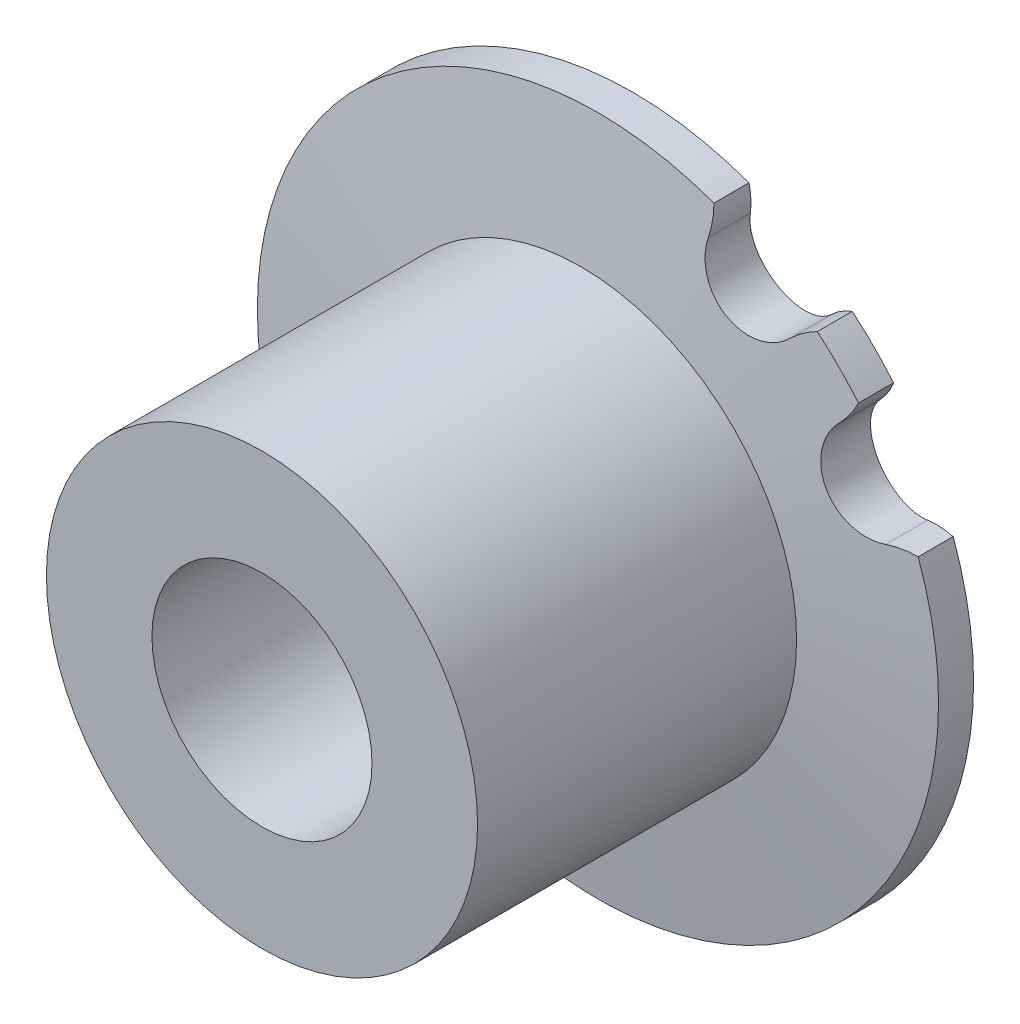
ISO-10303-21;
HEADER;
FILE_DESCRIPTION(('STEP AP214'),'2;1');
FILE_NAME('part.step','',(''),(''),'','','');
FILE_SCHEMA(('AUTOMOTIVE_DESIGN { 1 0 10303 214 1 1 1 1 }'));
ENDSEC;
DATA;
#1=APPLICATION_CONTEXT('core data for automotive mechanical design processes');
#2=APPLICATION_PROTOCOL_DEFINITION('international standard','automotive_design',2000,#1);
#3=PRODUCT_CONTEXT('',#1,'mechanical');
#4=PRODUCT('Part','Part','',(#3));
#5=PRODUCT_RELATED_PRODUCT_CATEGORY('part','',(#4));
#6=PRODUCT_DEFINITION_FORMATION('','',#4);
#7=PRODUCT_DEFINITION_CONTEXT('part definition',#1,'design');
#8=PRODUCT_DEFINITION('design','',#6,#7);
#9=PRODUCT_DEFINITION_SHAPE('','',#8);
#10=(LENGTH_UNIT() NAMED_UNIT(*) SI_UNIT(.MILLI.,.METRE.));
#11=(NAMED_UNIT(*) PLANE_ANGLE_UNIT() SI_UNIT($,.RADIAN.));
#12=(NAMED_UNIT(*) SI_UNIT($,.STERADIAN.) SOLID_ANGLE_UNIT());
#13=UNCERTAINTY_MEASURE_WITH_UNIT(LENGTH_MEASURE(1.E-05),#10,'distance_accuracy_value','');
#14=(GEOMETRIC_REPRESENTATION_CONTEXT(3) GLOBAL_UNCERTAINTY_ASSIGNED_CONTEXT((#13)) GLOBAL_UNIT_ASSIGNED_CONTEXT((#10,
#11,#12)) REPRESENTATION_CONTEXT('',''));
#15=CARTESIAN_POINT('',(0.,0.,0.));
#16=DIRECTION('',(0.,0.,1.));
#17=DIRECTION('',(1.,0.,0.));
#18=AXIS2_PLACEMENT_3D('',#15,#16,#17);
#19=CARTESIAN_POINT('',(0.,0.,-0.8));
#20=DIRECTION('',(0.,0.,-1.));
#21=DIRECTION('',(-1.,0.,0.));
#22=AXIS2_PLACEMENT_3D('',#19,#20,#21);
#23=PLANE('',#22);
#24=CARTESIAN_POINT('',(0.,0.,-0.799999999998249));
#25=DIRECTION('',(0.,0.,1.));
#26=DIRECTION('',(1.,0.,0.));
#27=AXIS2_PLACEMENT_3D('',#24,#25,#26);
#28=CIRCLE('',#27,4.72500000000764);
#29=CARTESIAN_POINT('',(4.72500000000764,0.,-0.799999999998249));
#30=VERTEX_POINT('',#29);
#31=EDGE_CURVE('E39',#30,#30,#28,.F.);
#32=ORIENTED_EDGE('',*,*,#31,.T.);
#33=EDGE_LOOP('',(#32));
#34=FACE_BOUND('',#33,.T.);
#35=CARTESIAN_POINT('',(0.,0.,-0.8));
#36=DIRECTION('',(0.,0.,1.));
#37=DIRECTION('',(1.,0.,0.));
#38=AXIS2_PLACEMENT_3D('',#35,#36,#37);
#39=CIRCLE('',#38,2.5527);
#40=CARTESIAN_POINT('',(2.5527,0.,-0.8));
#41=VERTEX_POINT('',#40);
#42=EDGE_CURVE('E279',#41,#41,#39,.T.);
#43=ORIENTED_EDGE('',*,*,#42,.T.);
#44=EDGE_LOOP('',(#43));
#45=FACE_BOUND('',#44,.T.);
#46=ADVANCED_FACE('F34',(#34,#45),#23,.T.);
#47=CARTESIAN_POINT('',(0.,0.,-0.406300000015847));
#48=DIRECTION('',(0.,0.,1.));
#49=DIRECTION('',(1.,0.,0.));
#50=AXIS2_PLACEMENT_3D('',#47,#48,#49);
#51=CONICAL_SURFACE('',#50,7.89999999989277,1.44742606851384);
#52=ORIENTED_EDGE('',*,*,#31,.F.);
#53=EDGE_LOOP('',(#52));
#54=FACE_BOUND('',#53,.T.);
#55=CARTESIAN_POINT('',(5.6633878781362,4.52642659741511,-0.486900000001804));
#56=CARTESIAN_POINT('',(5.70323999846953,4.5671311185864,-0.479888063827677));
#57=CARTESIAN_POINT('',(5.74126707334079,4.60962740082457,-0.472913935650916));
#58=CARTESIAN_POINT('',(5.81311095166015,4.69750934307928,-0.459140365734118));
#59=CARTESIAN_POINT('',(5.84695814458696,4.74287001497894,-0.452339988251805));
#60=CARTESIAN_POINT('',(5.91050928654359,4.83642972753544,-0.438902715557868));
#61=CARTESIAN_POINT('',(5.94021321995522,4.88462877889068,-0.432265820962577));
#62=CARTESIAN_POINT('',(5.99546470193269,4.98387422662841,-0.419143816616671));
#63=CARTESIAN_POINT('',(6.02097791788618,5.03493994774833,-0.412660300416595));
#64=CARTESIAN_POINT('',(6.04415414406782,5.08706208756621,-0.406300000002506));
#65=B_SPLINE_CURVE_WITH_KNOTS('',3,(#55,#56,#57,#58,#59,#60,#61,#62,#63,#64),.UNSPECIFIED.,.F.,
.F.,(4,2,2,2,4),(0.,0.172127752811509,0.342919429481872,0.513711749940532,0.685840154805954),.UNSPECIFIED.);
#66=CARTESIAN_POINT('',(5.6633878781361,4.52642659741506,-0.486900000001818));
#67=VERTEX_POINT('',#66);
#68=CARTESIAN_POINT('',(6.04415414406777,5.08706208756599,-0.406300000001253));
#69=VERTEX_POINT('',#68);
#70=EDGE_CURVE('E99',#67,#69,#65,.T.);
#71=ORIENTED_EDGE('',*,*,#70,.F.);
#72=CARTESIAN_POINT('',(5.66338787813615,4.52642659741516,-0.486900000001805));
#73=CARTESIAN_POINT('',(5.64106908345087,4.50362480164492,-0.490826971491648));
#74=CARTESIAN_POINT('',(5.61972496788327,4.479886647493,-0.494731978562252));
#75=CARTESIAN_POINT('',(5.57911462825524,4.43068513857594,-0.502471196304209));
#76=CARTESIAN_POINT('',(5.55984835940556,4.405221821017,-0.506305408500109));
#77=CARTESIAN_POINT('',(5.50540408316676,4.32653084448629,-0.517652146114848));
#78=CARTESIAN_POINT('',(5.47352300338086,4.27094321742129,-0.525018930336247));
#79=CARTESIAN_POINT('',(5.4195726257452,4.15511003334002,-0.539098441301466));
#80=CARTESIAN_POINT('',(5.39750914359883,4.09486174019644,-0.545810778533634));
#81=CARTESIAN_POINT('',(5.36386781321658,3.97142311008421,-0.558328968240294));
#82=CARTESIAN_POINT('',(5.35228689807333,3.90823363931469,-0.564135085437864));
#83=CARTESIAN_POINT('',(5.34001835123204,3.78104437235032,-0.574577910765766));
#84=CARTESIAN_POINT('',(5.33927453412871,3.71705047854365,-0.579220527741208));
#85=CARTESIAN_POINT('',(5.34860210394144,3.5897601057086,-0.587173601503889));
#86=CARTESIAN_POINT('',(5.35867473820345,3.52646370796548,-0.590483904589051));
#87=CARTESIAN_POINT('',(5.38923544126265,3.40301282291811,-0.595593071437972));
#88=CARTESIAN_POINT('',(5.40962381545149,3.34283422942947,-0.597405973121782));
#89=CARTESIAN_POINT('',(5.46019479298879,3.22672131385841,-0.599486547856637));
#90=CARTESIAN_POINT('',(5.4903762017454,3.17078647513282,-0.599754409302813));
#91=CARTESIAN_POINT('',(5.55944299822654,3.0651095360881,-0.598735744300202));
#92=CARTESIAN_POINT('',(5.59827118137945,3.01532993501737,-0.597459199808859));
#93=CARTESIAN_POINT('',(5.68362750239605,2.92294757754351,-0.593428926647428));
#94=CARTESIAN_POINT('',(5.73015596184563,2.88034512102876,-0.590675136272494));
#95=CARTESIAN_POINT('',(5.82962764216104,2.80345994815858,-0.583813113193446));
#96=CARTESIAN_POINT('',(5.8825773190042,2.76918571082534,-0.579703510076385));
#97=CARTESIAN_POINT('',(5.99335075149926,2.70993684033974,-0.570308973098324));
#98=CARTESIAN_POINT('',(6.05117466964725,2.6849625173758,-0.565024000043541));
#99=CARTESIAN_POINT('',(6.17053899409961,2.6448070343283,-0.553447547440831));
#100=CARTESIAN_POINT('',(6.23210506683476,2.6297044900137,-0.547148474316703));
#101=CARTESIAN_POINT('',(6.35681286108793,2.6099918814189,-0.533811275473411));
#102=CARTESIAN_POINT('',(6.41995411907639,2.60537876639211,-0.526773365260846));
#103=CARTESIAN_POINT('',(6.52832157883779,2.60653280529242,-0.514252124740415));
#104=CARTESIAN_POINT('',(6.57360523712539,2.60975136753019,-0.508886444683556));
#105=CARTESIAN_POINT('',(6.66337912105328,2.62157563776894,-0.497994338960198));
#106=CARTESIAN_POINT('',(6.70787035927045,2.6301738740618,-0.492468146360107));
#107=CARTESIAN_POINT('',(6.75169436079519,2.64142447524316,-0.486900000001803));
#108=B_SPLINE_CURVE_WITH_KNOTS('',3,(#72,#73,#74,#75,#76,#77,#78,#79,#80,#81,#82,#83,#84,#85,
#86,#87,#88,#89,#90,#91,#92,#93,#94,#95,#96,#97,#98,#99,#100,#101,#102,#103,#104,#105,#106,
#107),.UNSPECIFIED.,.F.,.F.,(4,2,2,2,2,2,2,2,2,2,2,2,2,2,2,2,2,4),(0.,0.0963841737467203,
0.192766269459475,0.385284494191656,0.577916610655706,0.770492350089633,0.962069314849387,
1.15366837450968,1.34345015276673,1.53320878941357,1.72174748382223,1.91029405414188,
2.09903178829932,2.28777581703264,2.47800520095799,2.66817925147085,2.80501223148445,
2.94165558783532),.UNSPECIFIED.);
#109=CARTESIAN_POINT('',(6.75169436079512,2.6414244752434,-0.486900000001799));
#110=VERTEX_POINT('',#109);
#111=EDGE_CURVE('E102',#67,#110,#108,.T.);
#112=ORIENTED_EDGE('',*,*,#111,.T.);
#113=CARTESIAN_POINT('',(7.42760207049504,2.69085998936904,-0.406300000002477));
#114=CARTESIAN_POINT('',(7.37087486022232,2.69684985864082,-0.412660300416569));
#115=CARTESIAN_POINT('',(7.31389404049314,2.70028762605283,-0.419143816616645));
#116=CARTESIAN_POINT('',(7.20031922055354,2.70206116293247,-0.432265820962555));
#117=CARTESIAN_POINT('',(7.14372565093575,2.70043632768329,-0.438902715557847));
#118=CARTESIAN_POINT('',(7.03092499211271,2.69217928058759,-0.452339988251787));
#119=CARTESIAN_POINT('',(6.97471790145145,2.68554708761601,-0.459140365734102));
#120=CARTESIAN_POINT('',(6.86268796776525,2.66726943501239,-0.472913935650904));
#121=CARTESIAN_POINT('',(6.80687157034496,2.65558516326134,-0.479888063827667));
#122=CARTESIAN_POINT('',(6.75169436079506,2.64142447524365,-0.486900000001795));
#123=B_SPLINE_CURVE_WITH_KNOTS('',3,(#113,#114,#115,#116,#117,#118,#119,#120,#121,#122),
.UNSPECIFIED.,.F.,.F.,(4,2,2,2,4),(0.,0.172128404865465,0.342920725324174,0.513712401994581,
0.685840154806138),.UNSPECIFIED.);
#124=CARTESIAN_POINT('',(7.42760207049476,2.69085998936893,-0.406300000001239));
#125=VERTEX_POINT('',#124);
#126=EDGE_CURVE('E117',#125,#110,#123,.T.);
#127=ORIENTED_EDGE('',*,*,#126,.F.);
#128=CARTESIAN_POINT('',(0.,0.,-0.4063));
#129=DIRECTION('',(0.,0.,-1.));
#130=DIRECTION('',(-1.,0.,0.));
#131=AXIS2_PLACEMENT_3D('',#128,#129,#130);
#132=CIRCLE('',#131,7.9);
#133=CARTESIAN_POINT('',(2.69085998936893,7.42760207049476,-0.406300000001239));
#134=VERTEX_POINT('',#133);
#135=EDGE_CURVE('E258',#134,#125,#132,.F.);
#136=ORIENTED_EDGE('',*,*,#135,.F.);
#137=CARTESIAN_POINT('',(2.64142447524365,6.75169436079506,-0.486900000001795));
#138=CARTESIAN_POINT('',(2.65558516326135,6.80687157034496,-0.479888063827667));
#139=CARTESIAN_POINT('',(2.66726943501239,6.86268796776525,-0.472913935650904));
#140=CARTESIAN_POINT('',(2.68554708761601,6.97471790145145,-0.459140365734102));
#141=CARTESIAN_POINT('',(2.69217928058759,7.03092499211271,-0.452339988251787));
#142=CARTESIAN_POINT('',(2.70043632768329,7.14372565093575,-0.438902715557847));
#143=CARTESIAN_POINT('',(2.70206116293247,7.20031922055354,-0.432265820962555));
#144=CARTESIAN_POINT('',(2.70028762605283,7.31389404049314,-0.419143816616645));
#145=CARTESIAN_POINT('',(2.69684985864082,7.37087486022232,-0.412660300416569));
#146=CARTESIAN_POINT('',(2.69085998936904,7.42760207049504,-0.406300000002478));
#147=B_SPLINE_CURVE_WITH_KNOTS('',3,(#137,#138,#139,#140,#141,#142,#143,#144,#145,#146),
.UNSPECIFIED.,.F.,.F.,(4,2,2,2,4),(0.,0.172127752811555,0.342919429481962,0.513711749940671,
0.685840154806136),.UNSPECIFIED.);
#148=CARTESIAN_POINT('',(2.6414244752434,6.75169436079513,-0.486900000001799));
#149=VERTEX_POINT('',#148);
#150=EDGE_CURVE('E120',#149,#134,#147,.T.);
#151=ORIENTED_EDGE('',*,*,#150,.F.);
#152=CARTESIAN_POINT('',(2.64142447524316,6.75169436079519,-0.486900000001803));
#153=CARTESIAN_POINT('',(2.63349672994898,6.72078802906361,-0.490826971491646));
#154=CARTESIAN_POINT('',(2.62688126072209,6.6895581267453,-0.494731978562251));
#155=CARTESIAN_POINT('',(2.61631242940642,6.62664320030458,-0.502471196304207));
#156=CARTESIAN_POINT('',(2.61235900992593,6.59495818600907,-0.506305408500107));
#157=CARTESIAN_POINT('',(2.60455437187783,6.49958766316547,-0.517652146114846));
#158=CARTESIAN_POINT('',(2.60473836041566,6.43550682609813,-0.525018930336245));
#159=CARTESIAN_POINT('',(2.61593255488004,6.30821715726469,-0.539098441301464));
#160=CARTESIAN_POINT('',(2.62694916541714,6.24500886379451,-0.545810778533633));
#161=CARTESIAN_POINT('',(2.65953423374512,6.12128720911784,-0.558328968240292));
#162=CARTESIAN_POINT('',(2.68109960241674,6.06077306460812,-0.564135085437863));
#163=CARTESIAN_POINT('',(2.73406936266685,5.94448965490761,-0.574577910765765));
#164=CARTESIAN_POINT('',(2.76542214506294,5.88869740863228,-0.579220527741206));
#165=CARTESIAN_POINT('',(2.83714524389386,5.7831244970063,-0.587173601503888));
#166=CARTESIAN_POINT('',(2.87751659991934,5.73334452572372,-0.59048390458905));
#167=CARTESIAN_POINT('',(2.96570838764981,5.64171327468262,-0.595593071437972));
#168=CARTESIAN_POINT('',(3.01345453438353,5.59979127105186,-0.597405973121781));
#169=CARTESIAN_POINT('',(3.11530674341057,5.5245200252285,-0.599486547856636));
#170=CARTESIAN_POINT('',(3.16941202947859,5.49116973831386,-0.599754409302813));
#171=CARTESIAN_POINT('',(3.28206409931163,5.43418422274752,-0.598735744300203));
#172=CARTESIAN_POINT('',(3.3405800928402,5.41048791520647,-0.597459199808859));
#173=CARTESIAN_POINT('',(3.4606920139511,5.3731606072809,-0.593428926647429));
#174=CARTESIAN_POINT('',(3.52228807009075,5.3595300274003,-0.590675136272495));
#175=CARTESIAN_POINT('',(3.64687565863612,5.34268135467807,-0.583813113193447));
#176=CARTESIAN_POINT('',(3.70986854257109,5.33947383287373,-0.579703510076386));
#177=CARTESIAN_POINT('',(3.83542558441901,5.34354952213519,-0.570308973098325));
#178=CARTESIAN_POINT('',(3.89798972796349,5.35083308308009,-0.565024000043542));
#179=CARTESIAN_POINT('',(4.02144000676855,5.37573957688591,-0.553447547440833));
#180=CARTESIAN_POINT('',(4.08230906192573,5.39344342621525,-0.547148474316704));
#181=CARTESIAN_POINT('',(4.2001654840963,5.43872570352389,-0.533811275473413));
#182=CARTESIAN_POINT('',(4.25715397505461,5.46630125771433,-0.526773365260847));
#183=CARTESIAN_POINT('',(4.35042592870142,5.52148441459966,-0.514252124740417));
#184=CARTESIAN_POINT('',(4.38803344603589,5.54691360040503,-0.508886444683558));
#185=CARTESIAN_POINT('',(4.45986777499447,5.60204066077694,-0.4979943389602));
#186=CARTESIAN_POINT('',(4.49409919938993,5.63173257094288,-0.492468146360109));
#187=CARTESIAN_POINT('',(4.52642659741516,5.66338787813615,-0.486900000001805));
#188=B_SPLINE_CURVE_WITH_KNOTS('',3,(#152,#153,#154,#155,#156,#157,#158,#159,#160,#161,#162,
#163,#164,#165,#166,#167,#168,#169,#170,#171,#172,#173,#174,#175,#176,#177,#178,#179,#180,#181,
#182,#183,#184,#185,#186,#187),.UNSPECIFIED.,.F.,.F.,(4,2,2,2,2,2,2,2,2,2,2,2,2,2,2,2,2,4),(0.,
0.0963841737467204,0.192766269459476,0.385284494191656,0.577916610655706,0.770492350089633,
0.962069314849388,1.15366837450969,1.34345015276673,1.53320878941357,1.72174748382223,
1.91029405414188,2.09903178829932,2.28777581703264,2.47800520095799,2.66817925147085,
2.80501223148445,2.94165558783531),.UNSPECIFIED.);
#189=CARTESIAN_POINT('',(4.52642659741514,5.66338787813618,-0.486900000001804));
#190=VERTEX_POINT('',#189);
#191=EDGE_CURVE('E200',#149,#190,#188,.T.);
#192=ORIENTED_EDGE('',*,*,#191,.T.);
#193=CARTESIAN_POINT('',(5.08706208756628,6.04415414406786,-0.406300000002497));
#194=CARTESIAN_POINT('',(5.0349399477484,6.02097791788621,-0.412660300416587));
#195=CARTESIAN_POINT('',(4.98387422662847,5.99546470193272,-0.419143816616663));
#196=CARTESIAN_POINT('',(4.88462877889073,5.94021321995525,-0.432265820962571));
#197=CARTESIAN_POINT('',(4.83642972753548,5.91050928654361,-0.438902715557863));
#198=CARTESIAN_POINT('',(4.74287001497897,5.84695814458698,-0.452339988251801));
#199=CARTESIAN_POINT('',(4.6975093430793,5.81311095166017,-0.459140365734115));
#200=CARTESIAN_POINT('',(4.60962740082458,5.7412670733408,-0.472913935650915));
#201=CARTESIAN_POINT('',(4.56713111858641,5.70323999846953,-0.479888063827677));
#202=CARTESIAN_POINT('',(4.52642659741511,5.6633878781362,-0.486900000001804));
#203=B_SPLINE_CURVE_WITH_KNOTS('',3,(#193,#194,#195,#196,#197,#198,#199,#200,#201,#202),
.UNSPECIFIED.,.F.,.F.,(4,2,2,2,4),(0.,0.172128404865439,0.342920725324124,0.513712401994508,
0.685840154806037),.UNSPECIFIED.);
#204=CARTESIAN_POINT('',(5.08706208756606,6.04415414406776,-0.406300000001248));
#205=VERTEX_POINT('',#204);
#206=EDGE_CURVE('E206',#205,#190,#203,.T.);
#207=ORIENTED_EDGE('',*,*,#206,.F.);
#208=CARTESIAN_POINT('',(0.,0.,-0.4063));
#209=DIRECTION('',(0.,0.,-1.));
#210=DIRECTION('',(-1.,0.,0.));
#211=AXIS2_PLACEMENT_3D('',#208,#209,#210);
#212=CIRCLE('',#211,7.9);
#213=EDGE_CURVE('E104',#69,#205,#212,.F.);
#214=ORIENTED_EDGE('',*,*,#213,.F.);
#215=EDGE_LOOP('',(#71,#112,#127,#136,#151,#192,#207,#214));
#216=FACE_BOUND('',#215,.T.);
#217=ADVANCED_FACE('F36',(#54,#216),#51,.T.);
#218=CARTESIAN_POINT('',(4.296485203779,5.864404644522,9.1));
#219=DIRECTION('',(0.,0.,1.));
#220=DIRECTION('',(1.,0.,0.));
#221=AXIS2_PLACEMENT_3D('',#218,#219,#220);
#222=CYLINDRICAL_SURFACE('',#221,1.912748853275);
#223=DIRECTION('',(0.,0.,1.));
#224=VECTOR('',#223,1.);
#225=CARTESIAN_POINT('',(5.663387878136,4.526426597415,9.1));
#226=LINE('',#225,#224);
#227=CARTESIAN_POINT('',(5.66338795331864,4.52642667422292,0.487059041894197));
#228=VERTEX_POINT('',#227);
#229=EDGE_CURVE('E108',#228,#67,#226,.F.);
#230=ORIENTED_EDGE('',*,*,#229,.T.);
#231=ORIENTED_EDGE('',*,*,#70,.T.);
#232=DIRECTION('',(0.,0.,-1.));
#233=VECTOR('',#232,1.);
#234=CARTESIAN_POINT('',(6.04415414406772,5.08706208756577,8.65));
#235=LINE('',#234,#233);
#236=CARTESIAN_POINT('',(6.04415414406915,5.08706208756908,0.406499999997359));
#237=VERTEX_POINT('',#236);
#238=EDGE_CURVE('E255',#237,#69,#235,.T.);
#239=ORIENTED_EDGE('',*,*,#238,.F.);
#240=CARTESIAN_POINT('',(5.66338802850128,4.52642675103083,0.48705902867219));
#241=CARTESIAN_POINT('',(5.70324015658535,4.56713128882251,0.480050652531425));
#242=CARTESIAN_POINT('',(5.74126723395961,4.60962758540833,0.473080065857144));
#243=CARTESIAN_POINT('',(5.81311110359416,4.69750954070697,0.459313492730647));
#244=CARTESIAN_POINT('',(5.84695828578498,4.74287021108461,0.452516570985646));
#245=CARTESIAN_POINT('',(5.91050939708898,4.83642990204518,0.439086129040634));
#246=CARTESIAN_POINT('',(5.94021331059941,4.88462893331585,0.432452609456043));
#247=CARTESIAN_POINT('',(5.99546474985894,4.98387432119242,0.419337279879443));
#248=CARTESIAN_POINT('',(6.02097794252597,5.03494000258592,0.412857062667525));
#249=CARTESIAN_POINT('',(6.04415414406885,5.08706208756852,0.406499999997523));
#250=B_SPLINE_CURVE_WITH_KNOTS('',3,(#240,#241,#242,#243,#244,#245,#246,#247,#248,#249),
.UNSPECIFIED.,.F.,.F.,(4,2,2,2,4),(0.,0.172126498838116,0.342916914831207,0.513707973970822,
0.685835124212785),.UNSPECIFIED.);
#251=EDGE_CURVE('E111',#228,#237,#250,.T.);
#252=ORIENTED_EDGE('',*,*,#251,.F.);
#253=EDGE_LOOP('',(#230,#231,#239,#252));
#254=FACE_BOUND('',#253,.T.);
#255=ADVANCED_FACE('F109',(#254),#222,.T.);
#256=CARTESIAN_POINT('',(0.,0.,8.65));
#257=DIRECTION('',(0.,0.,-1.));
#258=DIRECTION('',(-1.,0.,0.));
#259=AXIS2_PLACEMENT_3D('',#256,#257,#258);
#260=CYLINDRICAL_SURFACE('',#259,7.9);
#261=CARTESIAN_POINT('',(0.,0.,0.406499999996868));
#262=DIRECTION('',(0.,0.,-1.));
#263=DIRECTION('',(0.,-1.,0.));
#264=AXIS2_PLACEMENT_3D('',#261,#262,#263);
#265=CIRCLE('',#264,7.90000000000646);
#266=CARTESIAN_POINT('',(5.08706208756731,6.04415414406831,0.406499999997196));
#267=VERTEX_POINT('',#266);
#268=EDGE_CURVE('E263',#237,#267,#265,.F.);
#269=ORIENTED_EDGE('',*,*,#268,.F.);
#270=ORIENTED_EDGE('',*,*,#238,.T.);
#271=ORIENTED_EDGE('',*,*,#213,.T.);
#272=DIRECTION('',(0.,0.,1.));
#273=VECTOR('',#272,1.);
#274=CARTESIAN_POINT('',(5.0870620875661,6.04415414406778,9.1));
#275=LINE('',#274,#273);
#276=EDGE_CURVE('E214',#267,#205,#275,.F.);
#277=ORIENTED_EDGE('',*,*,#276,.F.);
#278=EDGE_LOOP('',(#269,#270,#271,#277));
#279=FACE_BOUND('',#278,.T.);
#280=ADVANCED_FACE('F220',(#279),#260,.T.);
#281=CARTESIAN_POINT('',(5.864404644522,4.296485203779,9.1));
#282=DIRECTION('',(0.,0.,1.));
#283=DIRECTION('',(1.,0.,0.));
#284=AXIS2_PLACEMENT_3D('',#281,#282,#283);
#285=CYLINDRICAL_SURFACE('',#284,1.912748853275);
#286=ORIENTED_EDGE('',*,*,#276,.T.);
#287=ORIENTED_EDGE('',*,*,#206,.T.);
#288=DIRECTION('',(0.,0.,1.));
#289=VECTOR('',#288,1.);
#290=CARTESIAN_POINT('',(4.526426597415,5.663387878136,9.1));
#291=LINE('',#290,#289);
#292=CARTESIAN_POINT('',(4.52642667437033,5.66338795346291,0.487059041868823));
#293=VERTEX_POINT('',#292);
#294=EDGE_CURVE('E205',#190,#293,#291,.T.);
#295=ORIENTED_EDGE('',*,*,#294,.T.);
#296=CARTESIAN_POINT('',(5.08706208756851,6.04415414406885,0.406499999997524));
#297=CARTESIAN_POINT('',(5.03494000261775,6.0209779425401,0.412857062663646));
#298=CARTESIAN_POINT('',(4.98387432125478,5.99546474989009,0.419337279871532));
#299=CARTESIAN_POINT('',(4.88462893343529,5.94021331066944,0.432452609439934));
#300=CARTESIAN_POINT('',(4.83642990219122,5.9105093971808,0.439086129020363));
#301=CARTESIAN_POINT('',(4.74287021128,5.84695828592507,0.452516570956905));
#302=CARTESIAN_POINT('',(4.6975095409251,5.81311110376073,0.459313492697598));
#303=CARTESIAN_POINT('',(4.60962758566809,5.74126723418383,0.47308006581532));
#304=CARTESIAN_POINT('',(4.56713128910109,5.70324015684082,0.480050652485132));
#305=CARTESIAN_POINT('',(4.52642675132564,5.66338802878986,0.48705902862144));
#306=B_SPLINE_CURVE_WITH_KNOTS('',3,(#296,#297,#298,#299,#300,#301,#302,#303,#304,#305),
.UNSPECIFIED.,.F.,.F.,(4,2,2,2,4),(0.,0.172127150136941,0.34291820917395,0.51370862506444,
0.685835123797536),.UNSPECIFIED.);
#307=EDGE_CURVE('E170',#267,#293,#306,.T.);
#308=ORIENTED_EDGE('',*,*,#307,.F.);
#309=EDGE_LOOP('',(#286,#287,#295,#308));
#310=FACE_BOUND('',#309,.T.);
#311=ADVANCED_FACE('F193',(#310),#285,.T.);
#312=CARTESIAN_POINT('',(3.735985557211,6.470916801433,9.1));
#313=DIRECTION('',(0.,0.,1.));
#314=DIRECTION('',(1.,0.,0.));
#315=AXIS2_PLACEMENT_3D('',#312,#313,#314);
#316=CYLINDRICAL_SURFACE('',#315,1.13);
#317=CARTESIAN_POINT('',(4.52642675132566,5.66338802878983,0.48705902862144));
#318=CARTESIAN_POINT('',(4.50362504456466,5.64106931251347,0.490983990731745));
#319=CARTESIAN_POINT('',(4.47988698790809,5.61972527004164,0.494886999437372));
#320=CARTESIAN_POINT('',(4.43068569379693,5.5791150653211,0.502622256016191));
#321=CARTESIAN_POINT('',(4.40522249359382,5.55984885822842,0.506454505415035));
#322=CARTESIAN_POINT('',(4.32653191803493,5.50540475923165,0.517795430965342));
#323=CARTESIAN_POINT('',(4.27094460868532,5.47352377243228,0.52515843963594));
#324=CARTESIAN_POINT('',(4.15511216996827,5.41957349961131,0.539230732337665));
#325=CARTESIAN_POINT('',(4.09486430512944,5.39751002797745,0.545939627140621));
#326=CARTESIAN_POINT('',(3.97142662696642,5.36386858653048,0.558451400658534));
#327=CARTESIAN_POINT('',(3.90823767952606,5.35228755085948,0.564254543872632));
#328=CARTESIAN_POINT('',(3.78104918690162,5.34001855389179,0.574692059784667));
#329=CARTESIAN_POINT('',(3.71705553770091,5.33927446563038,0.579332332193961));
#330=CARTESIAN_POINT('',(3.58976568126773,5.34860139319748,0.587281405134088));
#331=CARTESIAN_POINT('',(3.52646955535486,5.35867365683415,0.590590051983892));
#332=CARTESIAN_POINT('',(3.40301859097687,5.38923365066239,0.595696716440953));
#333=CARTESIAN_POINT('',(3.34283967069154,5.40962178694625,0.597508750650145));
#334=CARTESIAN_POINT('',(3.22672610328657,5.46019236579663,0.599588366088623));
#335=CARTESIAN_POINT('',(3.17079093972124,5.49037361421993,0.599856135546305));
#336=CARTESIAN_POINT('',(3.06511299943951,5.5594404064449,0.598838061578568));
#337=CARTESIAN_POINT('',(3.01533275935051,5.59826880196147,0.597562185189638));
#338=CARTESIAN_POINT('',(2.92294921462196,5.68362575971269,0.593533965047793));
#339=CARTESIAN_POINT('',(2.88034620987876,5.73015464354654,0.590781559619119));
#340=CARTESIAN_POINT('',(2.80346012028968,5.82962732894428,0.583922962742949));
#341=CARTESIAN_POINT('',(2.76918550508518,5.88257757945272,0.579815403080326));
#342=CARTESIAN_POINT('',(2.70993605544065,5.99335234318132,0.570425517205646));
#343=CARTESIAN_POINT('',(2.68496153097152,6.05117701878672,0.565143151846826));
#344=CARTESIAN_POINT('',(2.64480603721121,6.1705425458724,0.553572440470287));
#345=CARTESIAN_POINT('',(2.62970360825067,6.23210903964073,0.547276511968472));
#346=CARTESIAN_POINT('',(2.60999136529259,6.35681773037292,0.533945965635608));
#347=CARTESIAN_POINT('',(2.60537849923614,6.41995946359565,0.526911563295367));
#348=CARTESIAN_POINT('',(2.60653309003946,6.52832639795799,0.514396716991982));
#349=CARTESIAN_POINT('',(2.609751754985,6.57360906039287,0.509033872446234));
#350=CARTESIAN_POINT('',(2.62157600070597,6.66338099434962,0.498147525574393));
#351=CARTESIAN_POINT('',(2.63017411040612,6.70787127835353,0.49262425617732));
#352=CARTESIAN_POINT('',(2.64142447524293,6.75169436079432,0.487059055116286));
#353=B_SPLINE_CURVE_WITH_KNOTS('',3,(#317,#318,#319,#320,#321,#322,#323,#324,#325,#326,#327,
#328,#329,#330,#331,#332,#333,#334,#335,#336,#337,#338,#339,#340,#341,#342,#343,#344,#345,#346,
#347,#348,#349,#350,#351,#352),.UNSPECIFIED.,.F.,.F.,(4,2,2,2,2,2,2,2,2,2,2,2,2,2,2,2,2,4),(0.,
0.0963830850779007,0.192764089593183,0.385280072034465,0.577909920104485,0.770483410400833,
0.962059162904931,1.15365701856107,1.34343942820388,1.53319870502996,1.72173925255343,
1.91028767617457,2.09902705100534,2.2877727159338,2.47800229369148,2.66817651488076,
2.80500557867516,2.94164503220673),.UNSPECIFIED.);
#354=CARTESIAN_POINT('',(2.64142447524351,6.75169436079452,0.487059055116237));
#355=VERTEX_POINT('',#354);
#356=EDGE_CURVE('E183',#293,#355,#353,.T.);
#357=ORIENTED_EDGE('',*,*,#356,.F.);
#358=ORIENTED_EDGE('',*,*,#294,.F.);
#359=ORIENTED_EDGE('',*,*,#191,.F.);
#360=DIRECTION('',(0.,0.,1.));
#361=VECTOR('',#360,1.);
#362=CARTESIAN_POINT('',(2.64142447524359,6.75169436079485,9.1));
#363=LINE('',#362,#361);
#364=EDGE_CURVE('E269',#355,#149,#363,.F.);
#365=ORIENTED_EDGE('',*,*,#364,.F.);
#366=EDGE_LOOP('',(#357,#358,#359,#365));
#367=FACE_BOUND('',#366,.T.);
#368=ADVANCED_FACE('F189',(#367),#316,.F.);
#369=CARTESIAN_POINT('',(0.788663011196,7.226966002117,9.1));
#370=DIRECTION('',(0.,0.,1.));
#371=DIRECTION('',(1.,0.,0.));
#372=AXIS2_PLACEMENT_3D('',#369,#370,#371);
#373=CYLINDRICAL_SURFACE('',#372,1.912748853275);
#374=ORIENTED_EDGE('',*,*,#364,.T.);
#375=ORIENTED_EDGE('',*,*,#150,.T.);
#376=DIRECTION('',(0.,0.,-1.));
#377=VECTOR('',#376,1.);
#378=CARTESIAN_POINT('',(2.69085998936882,7.42760207049449,8.65));
#379=LINE('',#378,#377);
#380=CARTESIAN_POINT('',(2.69085998936858,7.42760207049801,0.406499999997358));
#381=VERTEX_POINT('',#380);
#382=EDGE_CURVE('E114',#381,#134,#379,.T.);
#383=ORIENTED_EDGE('',*,*,#382,.F.);
#384=CARTESIAN_POINT('',(2.64142447524342,6.75169436079419,0.487059055116278));
#385=CARTESIAN_POINT('',(2.65558517237226,6.80687160456316,0.480050676653406));
#386=CARTESIAN_POINT('',(2.66726944831444,6.86268803229256,0.473080087650473));
#387=CARTESIAN_POINT('',(2.68554710204547,6.97471800673742,0.459313509951409));
#388=CARTESIAN_POINT('',(2.69217929250207,7.03092510787377,0.452516585961654));
#389=CARTESIAN_POINT('',(2.70043633277599,7.14372576751142,0.439086139603329));
#390=CARTESIAN_POINT('',(2.70206116373705,7.20031932746721,0.432452617850178));
#391=CARTESIAN_POINT('',(2.7002876224676,7.31389411009614,0.419337284002216));
#392=CARTESIAN_POINT('',(2.69684985447246,7.37087490198581,0.4128570646894));
#393=CARTESIAN_POINT('',(2.69085998936878,7.42760207049751,0.406499999997499));
#394=B_SPLINE_CURVE_WITH_KNOTS('',3,(#384,#385,#386,#387,#388,#389,#390,#391,#392,#393),
.UNSPECIFIED.,.F.,.F.,(4,2,2,2,4),(0.,0.172126553559888,0.342917023014963,0.513708135617272,
0.685835340581733),.UNSPECIFIED.);
#395=EDGE_CURVE('E179',#355,#381,#394,.T.);
#396=ORIENTED_EDGE('',*,*,#395,.F.);
#397=EDGE_LOOP('',(#374,#375,#383,#396));
#398=FACE_BOUND('',#397,.T.);
#399=ADVANCED_FACE('F192',(#398),#373,.T.);
#400=CARTESIAN_POINT('',(7.226966002117,0.788663011196,9.1));
#401=DIRECTION('',(0.,0.,1.));
#402=DIRECTION('',(1.,0.,0.));
#403=AXIS2_PLACEMENT_3D('',#400,#401,#402);
#404=CYLINDRICAL_SURFACE('',#403,1.912748853275);
#405=DIRECTION('',(0.,0.,-1.));
#406=VECTOR('',#405,1.);
#407=CARTESIAN_POINT('',(7.42760207049449,2.69085998936882,8.65));
#408=LINE('',#407,#406);
#409=CARTESIAN_POINT('',(7.42760207049596,2.6908599893688,0.406499999997188));
#410=VERTEX_POINT('',#409);
#411=EDGE_CURVE('E261',#125,#410,#408,.F.);
#412=ORIENTED_EDGE('',*,*,#411,.F.);
#413=ORIENTED_EDGE('',*,*,#126,.T.);
#414=DIRECTION('',(0.,0.,1.));
#415=VECTOR('',#414,1.);
#416=CARTESIAN_POINT('',(6.75169436079497,2.6414244752431,9.1));
#417=LINE('',#416,#415);
#418=CARTESIAN_POINT('',(6.7516944651037,2.64142450200046,0.487059041868821));
#419=VERTEX_POINT('',#418);
#420=EDGE_CURVE('E54',#110,#419,#417,.T.);
#421=ORIENTED_EDGE('',*,*,#420,.T.);
#422=CARTESIAN_POINT('',(7.42760207049743,2.69085998936878,0.406499999997509));
#423=CARTESIAN_POINT('',(7.37087492006748,2.69684985255705,0.412857062663631));
#424=CARTESIAN_POINT('',(7.31389414642057,2.70028762027197,0.419337279871518));
#425=CARTESIAN_POINT('',(7.20031939975012,2.70206116422098,0.432452609439921));
#426=CARTESIAN_POINT('',(7.14372585751063,2.70043633617004,0.439086129020351));
#427=CARTESIAN_POINT('',(7.03092523278342,2.69217930483945,0.452516570956894));
#428=CARTESIAN_POINT('',(6.97471814884121,2.68554712041606,0.459313492697587));
#429=CARTESIAN_POINT('',(6.86268820826593,2.66726948188479,0.473080065815311));
#430=CARTESIAN_POINT('',(6.80687179720064,2.65558521515756,0.480050652485123));
#431=CARTESIAN_POINT('',(6.75169456941232,2.64142452875828,0.487059028621431));
#432=B_SPLINE_CURVE_WITH_KNOTS('',3,(#422,#423,#424,#425,#426,#427,#428,#429,#430,#431),
.UNSPECIFIED.,.F.,.F.,(4,2,2,2,4),(0.,0.172127150136956,0.342918209173982,0.513708625064489,
0.685835123797599),.UNSPECIFIED.);
#433=EDGE_CURVE('E154',#410,#419,#432,.T.);
#434=ORIENTED_EDGE('',*,*,#433,.F.);
#435=EDGE_LOOP('',(#412,#413,#421,#434));
#436=FACE_BOUND('',#435,.T.);
#437=ADVANCED_FACE('F142',(#436),#404,.T.);
#438=CARTESIAN_POINT('',(6.470916801433,3.735985557211,9.1));
#439=DIRECTION('',(0.,0.,1.));
#440=DIRECTION('',(1.,0.,0.));
#441=AXIS2_PLACEMENT_3D('',#438,#439,#440);
#442=CYLINDRICAL_SURFACE('',#441,1.13);
#443=CARTESIAN_POINT('',(6.75169456941243,2.64142452875782,0.487059028621438));
#444=CARTESIAN_POINT('',(6.72078835396957,2.63349680686314,0.490983990731745));
#445=CARTESIAN_POINT('',(6.68955857263258,2.62688135219135,0.494886999437373));
#446=CARTESIAN_POINT('',(6.62664389967296,2.61631253030606,0.502622256016195));
#447=CARTESIAN_POINT('',(6.59495901788906,2.61235910563078,0.50645450541504));
#448=CARTESIAN_POINT('',(6.49958893091827,2.60455442059288,0.517795430965345));
#449=CARTESIAN_POINT('',(6.43550841549382,2.60473833080171,0.525158439635941));
#450=CARTESIAN_POINT('',(6.30821944457208,2.61593224335617,0.539230732337664));
#451=CARTESIAN_POINT('',(6.24501152728095,2.62694864884498,0.54593962714062));
#452=CARTESIAN_POINT('',(6.12129064148412,2.6595331450135,0.558451400658533));
#453=CARTESIAN_POINT('',(6.06077688992687,2.68109814764045,0.564254543872631));
#454=CARTESIAN_POINT('',(5.9444939257613,2.73406713089965,0.574692059784658));
#455=CARTESIAN_POINT('',(5.88870175574197,2.76541955616293,0.579332332193947));
#456=CARTESIAN_POINT('',(5.78312897021031,2.83714184059185,0.587281405134079));
#457=CARTESIAN_POINT('',(5.73334904902688,2.87751273973131,0.590590051983888));
#458=CARTESIAN_POINT('',(5.64171737466752,2.96570395291549,0.595696716440974));
#459=CARTESIAN_POINT('',(5.59979496906971,3.01345005701624,0.597508750650175));
#460=CARTESIAN_POINT('',(5.5245229593983,3.11530224668735,0.599588366088628));
#461=CARTESIAN_POINT('',(5.49117231099785,3.16940755632207,0.599856135546302));
#462=CARTESIAN_POINT('',(5.4341859262082,3.28206012308485,0.598838061578588));
#463=CARTESIAN_POINT('',(5.41048917144374,3.34057662003236,0.597562185189739));
#464=CARTESIAN_POINT('',(5.37316115369186,3.4606896861986,0.59353396504803));
#465=CARTESIAN_POINT('',(5.35953031122274,3.52228638398249,0.590781559619287));
#466=CARTESIAN_POINT('',(5.34268134713825,3.64687530132795,0.583922962742327));
#467=CARTESIAN_POINT('',(5.33947378492115,3.70986887101882,0.579815403078805));
#468=CARTESIAN_POINT('',(5.34354963823573,3.83542735532703,0.57042551720388));
#469=CARTESIAN_POINT('',(5.35083340339905,3.89799225558881,0.565143151846126));
#470=CARTESIAN_POINT('',(5.37574048923722,4.02144358121425,0.553572440473762));
#471=CARTESIAN_POINT('',(5.39344464897271,4.08231294328657,0.547276511975515));
#472=CARTESIAN_POINT('',(5.43872769114507,4.20016995900155,0.533945965645985));
#473=CARTESIAN_POINT('',(5.46630369856369,4.25715873705705,0.526911563304545));
#474=CARTESIAN_POINT('',(5.52148708900414,4.35042999063857,0.51439671285496));
#475=CARTESIAN_POINT('',(5.54691588779136,4.38803662279827,0.509033863968951));
#476=CARTESIAN_POINT('',(5.60204200238001,4.45986932690463,0.498147508212843));
#477=CARTESIAN_POINT('',(5.63173335428247,4.49410001122422,0.492624234271649));
#478=CARTESIAN_POINT('',(5.66338802850126,4.52642675103085,0.48705902867219));
#479=B_SPLINE_CURVE_WITH_KNOTS('',3,(#443,#444,#445,#446,#447,#448,#449,#450,#451,#452,#453,
#454,#455,#456,#457,#458,#459,#460,#461,#462,#463,#464,#465,#466,#467,#468,#469,#470,#471,#472,
#473,#474,#475,#476,#477,#478),.UNSPECIFIED.,.F.,.F.,(4,2,2,2,2,2,2,2,2,2,2,2,2,2,2,2,2,4),(0.,
0.0963830850779315,0.192764089593245,0.385280072034465,0.5779099201045,0.770483410400834,
0.962059162904672,1.15365701856107,1.34343942820551,1.53319870502996,1.72173925254556,
1.91028767617457,2.09902705103829,2.2877727159338,2.47800229356765,2.66817651488076,
2.80500568668898,2.94164524840158),.UNSPECIFIED.);
#480=EDGE_CURVE('E147',#419,#228,#479,.T.);
#481=ORIENTED_EDGE('',*,*,#480,.F.);
#482=ORIENTED_EDGE('',*,*,#420,.F.);
#483=ORIENTED_EDGE('',*,*,#111,.F.);
#484=ORIENTED_EDGE('',*,*,#229,.F.);
#485=EDGE_LOOP('',(#481,#482,#483,#484));
#486=FACE_BOUND('',#485,.T.);
#487=ADVANCED_FACE('F116',(#486),#442,.F.);
#488=CARTESIAN_POINT('',(0.,0.,8.65));
#489=DIRECTION('',(0.,0.,-1.));
#490=DIRECTION('',(-1.,0.,0.));
#491=AXIS2_PLACEMENT_3D('',#488,#489,#490);
#492=CYLINDRICAL_SURFACE('',#491,7.9);
#493=ORIENTED_EDGE('',*,*,#135,.T.);
#494=ORIENTED_EDGE('',*,*,#411,.T.);
#495=CARTESIAN_POINT('',(0.,0.,0.406499999996868));
#496=DIRECTION('',(0.,0.,-1.));
#497=DIRECTION('',(0.,-1.,0.));
#498=AXIS2_PLACEMENT_3D('',#495,#496,#497);
#499=CIRCLE('',#498,7.90000000000646);
#500=EDGE_CURVE('E153',#381,#410,#499,.F.);
#501=ORIENTED_EDGE('',*,*,#500,.F.);
#502=ORIENTED_EDGE('',*,*,#382,.T.);
#503=EDGE_LOOP('',(#493,#494,#501,#502));
#504=FACE_BOUND('',#503,.T.);
#505=ADVANCED_FACE('F141',(#504),#492,.T.);
#506=CARTESIAN_POINT('',(0.,0.,0.406500000018184));
#507=DIRECTION('',(0.,0.,-1.));
#508=DIRECTION('',(-1.,0.,0.));
#509=AXIS2_PLACEMENT_3D('',#506,#507,#508);
#510=CONICAL_SURFACE('',#509,7.89999999983593,1.44748810721576);
#511=CARTESIAN_POINT('',(0.,0.,0.799999999998256));
#512=DIRECTION('',(0.,0.,-1.));
#513=DIRECTION('',(-1.,0.,0.));
#514=AXIS2_PLACEMENT_3D('',#511,#512,#513);
#515=CIRCLE('',#514,4.72500000000764);
#516=CARTESIAN_POINT('',(-4.72500000000764,0.,0.799999999998256));
#517=VERTEX_POINT('',#516);
#518=EDGE_CURVE('E155',#517,#517,#515,.F.);
#519=ORIENTED_EDGE('',*,*,#518,.F.);
#520=EDGE_LOOP('',(#519));
#521=FACE_BOUND('',#520,.T.);
#522=ORIENTED_EDGE('',*,*,#500,.T.);
#523=ORIENTED_EDGE('',*,*,#433,.T.);
#524=ORIENTED_EDGE('',*,*,#480,.T.);
#525=ORIENTED_EDGE('',*,*,#251,.T.);
#526=ORIENTED_EDGE('',*,*,#268,.T.);
#527=ORIENTED_EDGE('',*,*,#307,.T.);
#528=ORIENTED_EDGE('',*,*,#356,.T.);
#529=ORIENTED_EDGE('',*,*,#395,.T.);
#530=EDGE_LOOP('',(#522,#523,#524,#525,#526,#527,#528,#529));
#531=FACE_BOUND('',#530,.T.);
#532=ADVANCED_FACE('F161',(#521,#531),#510,.T.);
#533=CARTESIAN_POINT('',(0.,0.,8.2));
#534=DIRECTION('',(0.,0.,-1.));
#535=DIRECTION('',(-1.,0.,0.));
#536=AXIS2_PLACEMENT_3D('',#533,#534,#535);
#537=PLANE('',#536);
#538=CARTESIAN_POINT('',(0.,0.,8.2));
#539=DIRECTION('',(0.,0.,1.));
#540=DIRECTION('',(1.,0.,0.));
#541=AXIS2_PLACEMENT_3D('',#538,#539,#540);
#542=CIRCLE('',#541,2.55269999999999);
#543=CARTESIAN_POINT('',(2.55269999999999,0.,8.2));
#544=VERTEX_POINT('',#543);
#545=EDGE_CURVE('E282',#544,#544,#542,.T.);
#546=ORIENTED_EDGE('',*,*,#545,.F.);
#547=EDGE_LOOP('',(#546));
#548=FACE_BOUND('',#547,.T.);
#549=CARTESIAN_POINT('',(0.,0.,8.2));
#550=DIRECTION('',(0.,0.,-1.));
#551=DIRECTION('',(-1.,0.,0.));
#552=AXIS2_PLACEMENT_3D('',#549,#550,#551);
#553=CIRCLE('',#552,5.);
#554=CARTESIAN_POINT('',(-5.,0.,8.2));
#555=VERTEX_POINT('',#554);
#556=EDGE_CURVE('E45',#555,#555,#553,.T.);
#557=ORIENTED_EDGE('',*,*,#556,.F.);
#558=EDGE_LOOP('',(#557));
#559=FACE_BOUND('',#558,.T.);
#560=ADVANCED_FACE('F165',(#548,#559),#537,.F.);
#561=CARTESIAN_POINT('',(0.,0.,0.8));
#562=DIRECTION('',(0.,0.,-1.));
#563=DIRECTION('',(-1.,0.,0.));
#564=AXIS2_PLACEMENT_3D('',#561,#562,#563);
#565=PLANE('',#564);
#566=ORIENTED_EDGE('',*,*,#518,.T.);
#567=EDGE_LOOP('',(#566));
#568=FACE_BOUND('',#567,.T.);
#569=CARTESIAN_POINT('',(0.,0.,0.8));
#570=DIRECTION('',(0.,0.,-1.));
#571=DIRECTION('',(-1.,0.,0.));
#572=AXIS2_PLACEMENT_3D('',#569,#570,#571);
#573=CIRCLE('',#572,5.);
#574=CARTESIAN_POINT('',(-5.,0.,0.8));
#575=VERTEX_POINT('',#574);
#576=EDGE_CURVE('E11',#575,#575,#573,.F.);
#577=ORIENTED_EDGE('',*,*,#576,.F.);
#578=EDGE_LOOP('',(#577));
#579=FACE_BOUND('',#578,.T.);
#580=ADVANCED_FACE('F235',(#568,#579),#565,.T.);
#581=CARTESIAN_POINT('',(0.,0.,8.65));
#582=DIRECTION('',(0.,0.,-1.));
#583=DIRECTION('',(-1.,0.,0.));
#584=AXIS2_PLACEMENT_3D('',#581,#582,#583);
#585=CYLINDRICAL_SURFACE('',#584,5.);
#586=ORIENTED_EDGE('',*,*,#576,.T.);
#587=EDGE_LOOP('',(#586));
#588=FACE_BOUND('',#587,.T.);
#589=ORIENTED_EDGE('',*,*,#556,.T.);
#590=EDGE_LOOP('',(#589));
#591=FACE_BOUND('',#590,.T.);
#592=ADVANCED_FACE('F224',(#588,#591),#585,.T.);
#593=CARTESIAN_POINT('',(0.,0.,8.2));
#594=DIRECTION('',(0.,0.,1.));
#595=DIRECTION('',(1.,0.,0.));
#596=AXIS2_PLACEMENT_3D('',#593,#594,#595);
#597=CYLINDRICAL_SURFACE('',#596,2.55269999999999);
#598=ORIENTED_EDGE('',*,*,#42,.F.);
#599=EDGE_LOOP('',(#598));
#600=FACE_BOUND('',#599,.T.);
#601=ORIENTED_EDGE('',*,*,#545,.T.);
#602=EDGE_LOOP('',(#601));
#603=FACE_BOUND('',#602,.T.);
#604=ADVANCED_FACE('F231',(#600,#603),#597,.F.);
#605=CLOSED_SHELL('',(#46,#217,#255,#280,#311,#368,#399,#437,#487,#505,#532,#560,#580,#592,#604));
#606=MANIFOLD_SOLID_BREP('B2',#605);
#607=ADVANCED_BREP_SHAPE_REPRESENTATION('',(#18,#606),#14);
#608=SHAPE_DEFINITION_REPRESENTATION(#9,#607);
ENDSEC;
END-ISO-10303-21;
